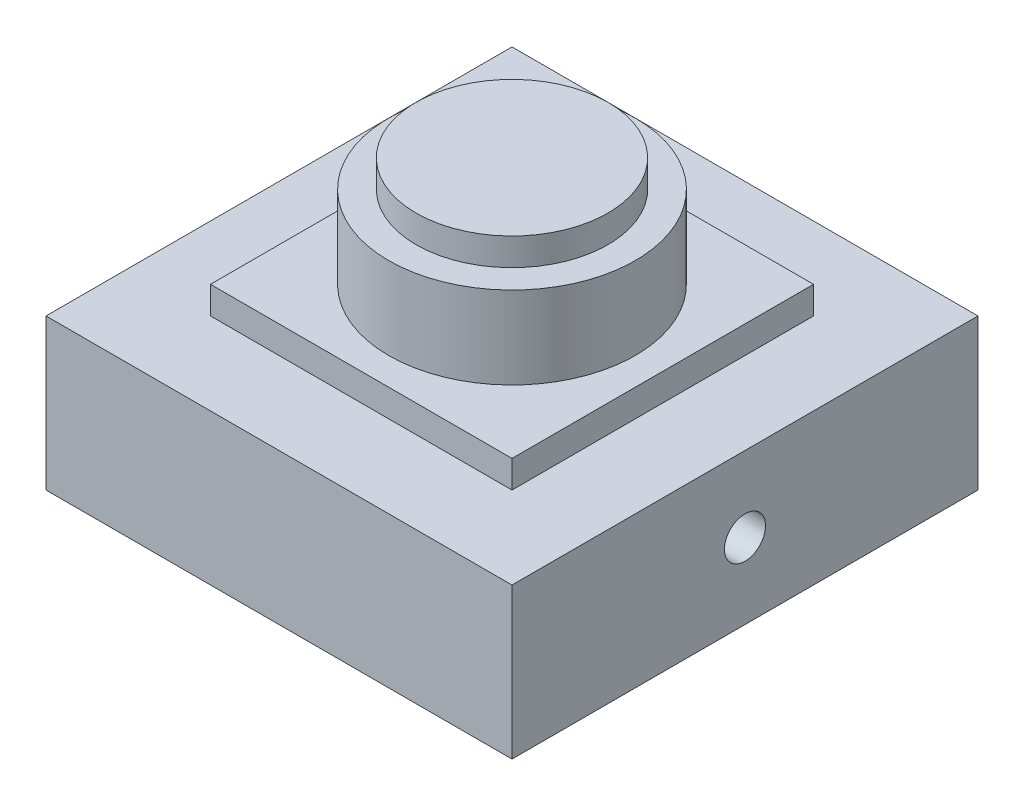
ISO-10303-21;
HEADER;
FILE_DESCRIPTION(('STEP AP214'),'2;1');
FILE_NAME('part.step','',(''),(''),'','','');
FILE_SCHEMA(('AUTOMOTIVE_DESIGN { 1 0 10303 214 1 1 1 1 }'));
ENDSEC;
DATA;
#1=APPLICATION_CONTEXT('core data for automotive mechanical design processes');
#2=APPLICATION_PROTOCOL_DEFINITION('international standard','automotive_design',2000,#1);
#3=PRODUCT_CONTEXT('',#1,'mechanical');
#4=PRODUCT('Part','Part','',(#3));
#5=PRODUCT_RELATED_PRODUCT_CATEGORY('part','',(#4));
#6=PRODUCT_DEFINITION_FORMATION('','',#4);
#7=PRODUCT_DEFINITION_CONTEXT('part definition',#1,'design');
#8=PRODUCT_DEFINITION('design','',#6,#7);
#9=PRODUCT_DEFINITION_SHAPE('','',#8);
#10=(LENGTH_UNIT() NAMED_UNIT(*) SI_UNIT(.MILLI.,.METRE.));
#11=(NAMED_UNIT(*) PLANE_ANGLE_UNIT() SI_UNIT($,.RADIAN.));
#12=(NAMED_UNIT(*) SI_UNIT($,.STERADIAN.) SOLID_ANGLE_UNIT());
#13=UNCERTAINTY_MEASURE_WITH_UNIT(LENGTH_MEASURE(1.E-05),#10,'distance_accuracy_value','');
#14=(GEOMETRIC_REPRESENTATION_CONTEXT(3) GLOBAL_UNCERTAINTY_ASSIGNED_CONTEXT((#13)) GLOBAL_UNIT_ASSIGNED_CONTEXT((#10,
#11,#12)) REPRESENTATION_CONTEXT('',''));
#15=CARTESIAN_POINT('',(0.,0.,0.));
#16=DIRECTION('',(0.,0.,1.));
#17=DIRECTION('',(1.,0.,0.));
#18=AXIS2_PLACEMENT_3D('',#15,#16,#17);
#19=CARTESIAN_POINT('',(0.,11.,0.));
#20=DIRECTION('',(0.,-1.,0.));
#21=DIRECTION('',(0.,0.,-1.));
#22=AXIS2_PLACEMENT_3D('',#19,#20,#21);
#23=PLANE('',#22);
#24=DIRECTION('',(0.,0.,-1.));
#25=VECTOR('',#24,1.);
#26=CARTESIAN_POINT('',(17.,11.,17.));
#27=LINE('',#26,#25);
#28=CARTESIAN_POINT('',(17.,11.,17.));
#29=VERTEX_POINT('',#28);
#30=CARTESIAN_POINT('',(17.,11.,-17.));
#31=VERTEX_POINT('',#30);
#32=EDGE_CURVE('E144',#29,#31,#27,.T.);
#33=ORIENTED_EDGE('',*,*,#32,.T.);
#34=DIRECTION('',(-1.,0.,0.));
#35=VECTOR('',#34,1.);
#36=CARTESIAN_POINT('',(-17.,11.,-17.));
#37=LINE('',#36,#35);
#38=CARTESIAN_POINT('',(-17.,11.,-17.));
#39=VERTEX_POINT('',#38);
#40=EDGE_CURVE('E148',#31,#39,#37,.T.);
#41=ORIENTED_EDGE('',*,*,#40,.T.);
#42=DIRECTION('',(0.,0.,1.));
#43=VECTOR('',#42,1.);
#44=CARTESIAN_POINT('',(-17.,11.,17.));
#45=LINE('',#44,#43);
#46=CARTESIAN_POINT('',(-17.,11.,17.));
#47=VERTEX_POINT('',#46);
#48=EDGE_CURVE('E152',#39,#47,#45,.T.);
#49=ORIENTED_EDGE('',*,*,#48,.T.);
#50=DIRECTION('',(1.,0.,0.));
#51=VECTOR('',#50,1.);
#52=CARTESIAN_POINT('',(-17.,11.,17.));
#53=LINE('',#52,#51);
#54=EDGE_CURVE('E155',#47,#29,#53,.T.);
#55=ORIENTED_EDGE('',*,*,#54,.T.);
#56=EDGE_LOOP('',(#33,#41,#49,#55));
#57=FACE_BOUND('',#56,.T.);
#58=DIRECTION('',(0.,0.,-1.));
#59=VECTOR('',#58,1.);
#60=CARTESIAN_POINT('',(11.,11.,11.));
#61=LINE('',#60,#59);
#62=CARTESIAN_POINT('',(11.,11.,11.));
#63=VERTEX_POINT('',#62);
#64=CARTESIAN_POINT('',(11.,11.,-11.));
#65=VERTEX_POINT('',#64);
#66=EDGE_CURVE('E60',#63,#65,#61,.T.);
#67=ORIENTED_EDGE('',*,*,#66,.F.);
#68=DIRECTION('',(1.,0.,0.));
#69=VECTOR('',#68,1.);
#70=CARTESIAN_POINT('',(-11.,11.,11.));
#71=LINE('',#70,#69);
#72=CARTESIAN_POINT('',(-11.,11.,11.));
#73=VERTEX_POINT('',#72);
#74=EDGE_CURVE('E64',#73,#63,#71,.T.);
#75=ORIENTED_EDGE('',*,*,#74,.F.);
#76=DIRECTION('',(0.,0.,1.));
#77=VECTOR('',#76,1.);
#78=CARTESIAN_POINT('',(-11.,11.,11.));
#79=LINE('',#78,#77);
#80=CARTESIAN_POINT('',(-11.,11.,-11.));
#81=VERTEX_POINT('',#80);
#82=EDGE_CURVE('E201',#81,#73,#79,.T.);
#83=ORIENTED_EDGE('',*,*,#82,.F.);
#84=DIRECTION('',(-1.,0.,0.));
#85=VECTOR('',#84,1.);
#86=CARTESIAN_POINT('',(-11.,11.,-11.));
#87=LINE('',#86,#85);
#88=EDGE_CURVE('E198',#65,#81,#87,.T.);
#89=ORIENTED_EDGE('',*,*,#88,.F.);
#90=EDGE_LOOP('',(#67,#75,#83,#89));
#91=FACE_BOUND('',#90,.T.);
#92=ADVANCED_FACE('F42',(#57,#91),#23,.F.);
#93=CARTESIAN_POINT('',(17.,11.,17.));
#94=DIRECTION('',(-1.,0.,0.));
#95=DIRECTION('',(0.,0.,1.));
#96=AXIS2_PLACEMENT_3D('',#93,#94,#95);
#97=PLANE('',#96);
#98=CARTESIAN_POINT('',(17.,5.5,0.));
#99=DIRECTION('',(1.,0.,0.));
#100=DIRECTION('',(0.,0.,-1.));
#101=AXIS2_PLACEMENT_3D('',#98,#99,#100);
#102=CIRCLE('',#101,1.5);
#103=CARTESIAN_POINT('',(17.,5.5,-1.5));
#104=VERTEX_POINT('',#103);
#105=EDGE_CURVE('E404',#104,#104,#102,.T.);
#106=ORIENTED_EDGE('',*,*,#105,.F.);
#107=EDGE_LOOP('',(#106));
#108=FACE_BOUND('',#107,.T.);
#109=DIRECTION('',(0.,0.,-1.));
#110=VECTOR('',#109,1.);
#111=CARTESIAN_POINT('',(17.,0.,17.));
#112=LINE('',#111,#110);
#113=CARTESIAN_POINT('',(17.,0.,17.));
#114=VERTEX_POINT('',#113);
#115=CARTESIAN_POINT('',(17.,0.,-17.));
#116=VERTEX_POINT('',#115);
#117=EDGE_CURVE('E133',#114,#116,#112,.T.);
#118=ORIENTED_EDGE('',*,*,#117,.T.);
#119=DIRECTION('',(0.,-1.,0.));
#120=VECTOR('',#119,1.);
#121=CARTESIAN_POINT('',(17.,11.,-17.));
#122=LINE('',#121,#120);
#123=EDGE_CURVE('E46',#31,#116,#122,.T.);
#124=ORIENTED_EDGE('',*,*,#123,.F.);
#125=ORIENTED_EDGE('',*,*,#32,.F.);
#126=DIRECTION('',(0.,-1.,0.));
#127=VECTOR('',#126,1.);
#128=CARTESIAN_POINT('',(17.,11.,17.));
#129=LINE('',#128,#127);
#130=EDGE_CURVE('E157',#29,#114,#129,.T.);
#131=ORIENTED_EDGE('',*,*,#130,.T.);
#132=EDGE_LOOP('',(#118,#124,#125,#131));
#133=FACE_BOUND('',#132,.T.);
#134=ADVANCED_FACE('F44',(#108,#133),#97,.F.);
#135=CARTESIAN_POINT('',(-17.,11.,-17.));
#136=DIRECTION('',(0.,0.,1.));
#137=DIRECTION('',(1.,0.,0.));
#138=AXIS2_PLACEMENT_3D('',#135,#136,#137);
#139=PLANE('',#138);
#140=DIRECTION('',(-1.,0.,0.));
#141=VECTOR('',#140,1.);
#142=CARTESIAN_POINT('',(-17.,0.,-17.));
#143=LINE('',#142,#141);
#144=CARTESIAN_POINT('',(-17.,0.,-17.));
#145=VERTEX_POINT('',#144);
#146=EDGE_CURVE('E138',#116,#145,#143,.T.);
#147=ORIENTED_EDGE('',*,*,#146,.T.);
#148=DIRECTION('',(0.,-1.,0.));
#149=VECTOR('',#148,1.);
#150=CARTESIAN_POINT('',(-17.,11.,-17.));
#151=LINE('',#150,#149);
#152=EDGE_CURVE('E172',#39,#145,#151,.T.);
#153=ORIENTED_EDGE('',*,*,#152,.F.);
#154=ORIENTED_EDGE('',*,*,#40,.F.);
#155=ORIENTED_EDGE('',*,*,#123,.T.);
#156=EDGE_LOOP('',(#147,#153,#154,#155));
#157=FACE_BOUND('',#156,.T.);
#158=ADVANCED_FACE('F221',(#157),#139,.F.);
#159=CARTESIAN_POINT('',(-17.,11.,17.));
#160=DIRECTION('',(1.,0.,0.));
#161=DIRECTION('',(0.,0.,-1.));
#162=AXIS2_PLACEMENT_3D('',#159,#160,#161);
#163=PLANE('',#162);
#164=CARTESIAN_POINT('',(-17.,5.5,0.));
#165=DIRECTION('',(1.,0.,0.));
#166=DIRECTION('',(0.,0.,-1.));
#167=AXIS2_PLACEMENT_3D('',#164,#165,#166);
#168=CIRCLE('',#167,1.5);
#169=CARTESIAN_POINT('',(-17.,5.5,-1.5));
#170=VERTEX_POINT('',#169);
#171=EDGE_CURVE('E401',#170,#170,#168,.F.);
#172=ORIENTED_EDGE('',*,*,#171,.F.);
#173=EDGE_LOOP('',(#172));
#174=FACE_BOUND('',#173,.T.);
#175=DIRECTION('',(0.,0.,1.));
#176=VECTOR('',#175,1.);
#177=CARTESIAN_POINT('',(-17.,0.,17.));
#178=LINE('',#177,#176);
#179=CARTESIAN_POINT('',(-17.,0.,17.));
#180=VERTEX_POINT('',#179);
#181=EDGE_CURVE('E161',#145,#180,#178,.T.);
#182=ORIENTED_EDGE('',*,*,#181,.T.);
#183=DIRECTION('',(0.,-1.,0.));
#184=VECTOR('',#183,1.);
#185=CARTESIAN_POINT('',(-17.,11.,17.));
#186=LINE('',#185,#184);
#187=EDGE_CURVE('E169',#47,#180,#186,.T.);
#188=ORIENTED_EDGE('',*,*,#187,.F.);
#189=ORIENTED_EDGE('',*,*,#48,.F.);
#190=ORIENTED_EDGE('',*,*,#152,.T.);
#191=EDGE_LOOP('',(#182,#188,#189,#190));
#192=FACE_BOUND('',#191,.T.);
#193=ADVANCED_FACE('F233',(#174,#192),#163,.F.);
#194=CARTESIAN_POINT('',(-17.,11.,17.));
#195=DIRECTION('',(0.,0.,-1.));
#196=DIRECTION('',(-1.,0.,0.));
#197=AXIS2_PLACEMENT_3D('',#194,#195,#196);
#198=PLANE('',#197);
#199=DIRECTION('',(1.,0.,0.));
#200=VECTOR('',#199,1.);
#201=CARTESIAN_POINT('',(-17.,0.,17.));
#202=LINE('',#201,#200);
#203=EDGE_CURVE('E149',#180,#114,#202,.T.);
#204=ORIENTED_EDGE('',*,*,#203,.T.);
#205=ORIENTED_EDGE('',*,*,#130,.F.);
#206=ORIENTED_EDGE('',*,*,#54,.F.);
#207=ORIENTED_EDGE('',*,*,#187,.T.);
#208=EDGE_LOOP('',(#204,#205,#206,#207));
#209=FACE_BOUND('',#208,.T.);
#210=ADVANCED_FACE('F229',(#209),#198,.F.);
#211=CARTESIAN_POINT('',(0.,0.,0.));
#212=DIRECTION('',(0.,-1.,0.));
#213=DIRECTION('',(0.,0.,-1.));
#214=AXIS2_PLACEMENT_3D('',#211,#212,#213);
#215=PLANE('',#214);
#216=ORIENTED_EDGE('',*,*,#117,.F.);
#217=ORIENTED_EDGE('',*,*,#203,.F.);
#218=ORIENTED_EDGE('',*,*,#181,.F.);
#219=ORIENTED_EDGE('',*,*,#146,.F.);
#220=EDGE_LOOP('',(#216,#217,#218,#219));
#221=FACE_BOUND('',#220,.T.);
#222=ADVANCED_FACE('F226',(#221),#215,.T.);
#223=CARTESIAN_POINT('',(11.,13.,11.));
#224=DIRECTION('',(-1.,0.,0.));
#225=DIRECTION('',(0.,0.,1.));
#226=AXIS2_PLACEMENT_3D('',#223,#224,#225);
#227=PLANE('',#226);
#228=ORIENTED_EDGE('',*,*,#66,.T.);
#229=DIRECTION('',(0.,-1.,0.));
#230=VECTOR('',#229,1.);
#231=CARTESIAN_POINT('',(11.,13.,-11.));
#232=LINE('',#231,#230);
#233=CARTESIAN_POINT('',(11.,13.,-11.));
#234=VERTEX_POINT('',#233);
#235=EDGE_CURVE('E113',#234,#65,#232,.T.);
#236=ORIENTED_EDGE('',*,*,#235,.F.);
#237=DIRECTION('',(0.,0.,-1.));
#238=VECTOR('',#237,1.);
#239=CARTESIAN_POINT('',(11.,13.,11.));
#240=LINE('',#239,#238);
#241=CARTESIAN_POINT('',(11.,13.,11.));
#242=VERTEX_POINT('',#241);
#243=EDGE_CURVE('E120',#242,#234,#240,.T.);
#244=ORIENTED_EDGE('',*,*,#243,.F.);
#245=DIRECTION('',(0.,-1.,0.));
#246=VECTOR('',#245,1.);
#247=CARTESIAN_POINT('',(11.,13.,11.));
#248=LINE('',#247,#246);
#249=EDGE_CURVE('E195',#242,#63,#248,.T.);
#250=ORIENTED_EDGE('',*,*,#249,.T.);
#251=EDGE_LOOP('',(#228,#236,#244,#250));
#252=FACE_BOUND('',#251,.T.);
#253=ADVANCED_FACE('F131',(#252),#227,.F.);
#254=CARTESIAN_POINT('',(-11.,13.,-11.));
#255=DIRECTION('',(0.,0.,1.));
#256=DIRECTION('',(1.,0.,0.));
#257=AXIS2_PLACEMENT_3D('',#254,#255,#256);
#258=PLANE('',#257);
#259=ORIENTED_EDGE('',*,*,#88,.T.);
#260=DIRECTION('',(0.,-1.,0.));
#261=VECTOR('',#260,1.);
#262=CARTESIAN_POINT('',(-11.,13.,-11.));
#263=LINE('',#262,#261);
#264=CARTESIAN_POINT('',(-11.,13.,-11.));
#265=VERTEX_POINT('',#264);
#266=EDGE_CURVE('E115',#265,#81,#263,.T.);
#267=ORIENTED_EDGE('',*,*,#266,.F.);
#268=DIRECTION('',(-1.,0.,0.));
#269=VECTOR('',#268,1.);
#270=CARTESIAN_POINT('',(-11.,13.,-11.));
#271=LINE('',#270,#269);
#272=EDGE_CURVE('E108',#234,#265,#271,.T.);
#273=ORIENTED_EDGE('',*,*,#272,.F.);
#274=ORIENTED_EDGE('',*,*,#235,.T.);
#275=EDGE_LOOP('',(#259,#267,#273,#274));
#276=FACE_BOUND('',#275,.T.);
#277=ADVANCED_FACE('F111',(#276),#258,.F.);
#278=CARTESIAN_POINT('',(-11.,13.,11.));
#279=DIRECTION('',(1.,0.,0.));
#280=DIRECTION('',(0.,0.,-1.));
#281=AXIS2_PLACEMENT_3D('',#278,#279,#280);
#282=PLANE('',#281);
#283=ORIENTED_EDGE('',*,*,#82,.T.);
#284=DIRECTION('',(0.,-1.,0.));
#285=VECTOR('',#284,1.);
#286=CARTESIAN_POINT('',(-11.,13.,11.));
#287=LINE('',#286,#285);
#288=CARTESIAN_POINT('',(-11.,13.,11.));
#289=VERTEX_POINT('',#288);
#290=EDGE_CURVE('E140',#289,#73,#287,.T.);
#291=ORIENTED_EDGE('',*,*,#290,.F.);
#292=DIRECTION('',(0.,0.,1.));
#293=VECTOR('',#292,1.);
#294=CARTESIAN_POINT('',(-11.,13.,11.));
#295=LINE('',#294,#293);
#296=EDGE_CURVE('E119',#265,#289,#295,.T.);
#297=ORIENTED_EDGE('',*,*,#296,.F.);
#298=ORIENTED_EDGE('',*,*,#266,.T.);
#299=EDGE_LOOP('',(#283,#291,#297,#298));
#300=FACE_BOUND('',#299,.T.);
#301=ADVANCED_FACE('F213',(#300),#282,.F.);
#302=CARTESIAN_POINT('',(-11.,13.,11.));
#303=DIRECTION('',(0.,0.,-1.));
#304=DIRECTION('',(-1.,0.,0.));
#305=AXIS2_PLACEMENT_3D('',#302,#303,#304);
#306=PLANE('',#305);
#307=ORIENTED_EDGE('',*,*,#74,.T.);
#308=ORIENTED_EDGE('',*,*,#249,.F.);
#309=DIRECTION('',(1.,0.,0.));
#310=VECTOR('',#309,1.);
#311=CARTESIAN_POINT('',(-11.,13.,11.));
#312=LINE('',#311,#310);
#313=EDGE_CURVE('E125',#289,#242,#312,.T.);
#314=ORIENTED_EDGE('',*,*,#313,.F.);
#315=ORIENTED_EDGE('',*,*,#290,.T.);
#316=EDGE_LOOP('',(#307,#308,#314,#315));
#317=FACE_BOUND('',#316,.T.);
#318=ADVANCED_FACE('F211',(#317),#306,.F.);
#319=CARTESIAN_POINT('',(0.,13.,0.));
#320=DIRECTION('',(0.,-1.,0.));
#321=DIRECTION('',(0.,0.,-1.));
#322=AXIS2_PLACEMENT_3D('',#319,#320,#321);
#323=PLANE('',#322);
#324=CARTESIAN_POINT('',(0.,13.,0.));
#325=DIRECTION('',(0.,1.,0.));
#326=DIRECTION('',(0.,0.,1.));
#327=AXIS2_PLACEMENT_3D('',#324,#325,#326);
#328=CIRCLE('',#327,9.);
#329=CARTESIAN_POINT('',(0.,13.,9.));
#330=VERTEX_POINT('',#329);
#331=EDGE_CURVE('E52',#330,#330,#328,.T.);
#332=ORIENTED_EDGE('',*,*,#331,.F.);
#333=EDGE_LOOP('',(#332));
#334=FACE_BOUND('',#333,.T.);
#335=ORIENTED_EDGE('',*,*,#243,.T.);
#336=ORIENTED_EDGE('',*,*,#272,.T.);
#337=ORIENTED_EDGE('',*,*,#296,.T.);
#338=ORIENTED_EDGE('',*,*,#313,.T.);
#339=EDGE_LOOP('',(#335,#336,#337,#338));
#340=FACE_BOUND('',#339,.T.);
#341=ADVANCED_FACE('F123',(#334,#340),#323,.F.);
#342=CARTESIAN_POINT('',(0.,19.,0.));
#343=DIRECTION('',(0.,-1.,0.));
#344=DIRECTION('',(0.,0.,-1.));
#345=AXIS2_PLACEMENT_3D('',#342,#343,#344);
#346=CYLINDRICAL_SURFACE('',#345,9.);
#347=CARTESIAN_POINT('',(0.,19.,0.));
#348=DIRECTION('',(0.,1.,0.));
#349=DIRECTION('',(0.,0.,1.));
#350=AXIS2_PLACEMENT_3D('',#347,#348,#349);
#351=CIRCLE('',#350,9.);
#352=CARTESIAN_POINT('',(0.,19.,9.));
#353=VERTEX_POINT('',#352);
#354=EDGE_CURVE('E189',#353,#353,#351,.T.);
#355=ORIENTED_EDGE('',*,*,#354,.F.);
#356=EDGE_LOOP('',(#355));
#357=FACE_BOUND('',#356,.T.);
#358=ORIENTED_EDGE('',*,*,#331,.T.);
#359=EDGE_LOOP('',(#358));
#360=FACE_BOUND('',#359,.T.);
#361=ADVANCED_FACE('F293',(#357,#360),#346,.T.);
#362=CARTESIAN_POINT('',(0.,19.,0.));
#363=DIRECTION('',(0.,1.,0.));
#364=DIRECTION('',(0.,0.,1.));
#365=AXIS2_PLACEMENT_3D('',#362,#363,#364);
#366=PLANE('',#365);
#367=CARTESIAN_POINT('',(0.,19.,0.));
#368=DIRECTION('',(0.,1.,0.));
#369=DIRECTION('',(0.,0.,1.));
#370=AXIS2_PLACEMENT_3D('',#367,#368,#369);
#371=CIRCLE('',#370,7.);
#372=CARTESIAN_POINT('',(0.,19.,7.));
#373=VERTEX_POINT('',#372);
#374=EDGE_CURVE('E11',#373,#373,#371,.T.);
#375=ORIENTED_EDGE('',*,*,#374,.F.);
#376=EDGE_LOOP('',(#375));
#377=FACE_BOUND('',#376,.T.);
#378=ORIENTED_EDGE('',*,*,#354,.T.);
#379=EDGE_LOOP('',(#378));
#380=FACE_BOUND('',#379,.T.);
#381=ADVANCED_FACE('F301',(#377,#380),#366,.T.);
#382=CARTESIAN_POINT('',(0.,21.,0.));
#383=DIRECTION('',(0.,-1.,0.));
#384=DIRECTION('',(0.,0.,-1.));
#385=AXIS2_PLACEMENT_3D('',#382,#383,#384);
#386=CYLINDRICAL_SURFACE('',#385,7.);
#387=CARTESIAN_POINT('',(0.,21.,0.));
#388=DIRECTION('',(0.,1.,0.));
#389=DIRECTION('',(0.,0.,1.));
#390=AXIS2_PLACEMENT_3D('',#387,#388,#389);
#391=CIRCLE('',#390,7.);
#392=CARTESIAN_POINT('',(0.,21.,7.));
#393=VERTEX_POINT('',#392);
#394=EDGE_CURVE('E408',#393,#393,#391,.T.);
#395=ORIENTED_EDGE('',*,*,#394,.F.);
#396=EDGE_LOOP('',(#395));
#397=FACE_BOUND('',#396,.T.);
#398=ORIENTED_EDGE('',*,*,#374,.T.);
#399=EDGE_LOOP('',(#398));
#400=FACE_BOUND('',#399,.T.);
#401=ADVANCED_FACE('F309',(#397,#400),#386,.T.);
#402=CARTESIAN_POINT('',(0.,21.,0.));
#403=DIRECTION('',(0.,1.,0.));
#404=DIRECTION('',(0.,0.,1.));
#405=AXIS2_PLACEMENT_3D('',#402,#403,#404);
#406=PLANE('',#405);
#407=ORIENTED_EDGE('',*,*,#394,.T.);
#408=EDGE_LOOP('',(#407));
#409=FACE_BOUND('',#408,.T.);
#410=ADVANCED_FACE('F317',(#409),#406,.T.);
#411=CARTESIAN_POINT('',(-21.2426406871193,5.5,0.));
#412=DIRECTION('',(1.,0.,0.));
#413=DIRECTION('',(0.,0.,-1.));
#414=AXIS2_PLACEMENT_3D('',#411,#412,#413);
#415=CYLINDRICAL_SURFACE('',#414,1.5);
#416=CARTESIAN_POINT('',(-17.,5.5,-1.5));
#417=CARTESIAN_POINT('',(-16.6458333333333,5.5,-1.5));
#418=CARTESIAN_POINT('',(-16.2916666666667,5.5,-1.5));
#419=CARTESIAN_POINT('',(-15.5833333333333,5.5,-1.5));
#420=CARTESIAN_POINT('',(-15.2291666666667,5.5,-1.5));
#421=CARTESIAN_POINT('',(-14.5208333333333,5.5,-1.5));
#422=CARTESIAN_POINT('',(-14.1666666666667,5.5,-1.5));
#423=CARTESIAN_POINT('',(-13.4583333333333,5.5,-1.5));
#424=CARTESIAN_POINT('',(-13.1041666666667,5.5,-1.5));
#425=CARTESIAN_POINT('',(-12.3958333333333,5.5,-1.5));
#426=CARTESIAN_POINT('',(-12.0416666666667,5.5,-1.5));
#427=CARTESIAN_POINT('',(-11.3333333333333,5.5,-1.5));
#428=CARTESIAN_POINT('',(-10.9791666666667,5.5,-1.5));
#429=CARTESIAN_POINT('',(-10.2708333333333,5.5,-1.5));
#430=CARTESIAN_POINT('',(-9.91666666666667,5.5,-1.5));
#431=CARTESIAN_POINT('',(-9.20833333333334,5.5,-1.5));
#432=CARTESIAN_POINT('',(-8.85416666666667,5.5,-1.5));
#433=CARTESIAN_POINT('',(-8.14583333333334,5.5,-1.5));
#434=CARTESIAN_POINT('',(-7.79166666666667,5.5,-1.5));
#435=CARTESIAN_POINT('',(-7.08333333333334,5.5,-1.5));
#436=CARTESIAN_POINT('',(-6.72916666666667,5.5,-1.5));
#437=CARTESIAN_POINT('',(-6.02083333333334,5.5,-1.5));
#438=CARTESIAN_POINT('',(-5.66666666666667,5.5,-1.5));
#439=CARTESIAN_POINT('',(-4.95833333333334,5.5,-1.5));
#440=CARTESIAN_POINT('',(-4.60416666666667,5.5,-1.5));
#441=CARTESIAN_POINT('',(-3.89583333333334,5.5,-1.5));
#442=CARTESIAN_POINT('',(-3.54166666666667,5.5,-1.5));
#443=CARTESIAN_POINT('',(-2.83333333333334,5.5,-1.5));
#444=CARTESIAN_POINT('',(-2.47916666666667,5.5,-1.5));
#445=CARTESIAN_POINT('',(-1.77083333333334,5.5,-1.5));
#446=CARTESIAN_POINT('',(-1.41666666666667,5.5,-1.5));
#447=CARTESIAN_POINT('',(-0.708333333333341,5.5,-1.5));
#448=CARTESIAN_POINT('',(-0.354166666666674,5.5,-1.5));
#449=CARTESIAN_POINT('',(0.35416666666666,5.5,-1.5));
#450=CARTESIAN_POINT('',(0.708333333333327,5.5,-1.5));
#451=CARTESIAN_POINT('',(1.41666666666666,5.5,-1.5));
#452=CARTESIAN_POINT('',(1.77083333333333,5.5,-1.5));
#453=CARTESIAN_POINT('',(2.47916666666666,5.5,-1.5));
#454=CARTESIAN_POINT('',(2.83333333333333,5.5,-1.5));
#455=CARTESIAN_POINT('',(3.54166666666666,5.5,-1.5));
#456=CARTESIAN_POINT('',(3.89583333333333,5.5,-1.5));
#457=CARTESIAN_POINT('',(4.60416666666666,5.5,-1.5));
#458=CARTESIAN_POINT('',(4.95833333333333,5.5,-1.5));
#459=CARTESIAN_POINT('',(5.66666666666666,5.5,-1.5));
#460=CARTESIAN_POINT('',(6.02083333333333,5.5,-1.5));
#461=CARTESIAN_POINT('',(6.72916666666666,5.5,-1.5));
#462=CARTESIAN_POINT('',(7.08333333333333,5.5,-1.5));
#463=CARTESIAN_POINT('',(7.79166666666666,5.5,-1.5));
#464=CARTESIAN_POINT('',(8.14583333333333,5.5,-1.5));
#465=CARTESIAN_POINT('',(8.85416666666666,5.5,-1.5));
#466=CARTESIAN_POINT('',(9.20833333333333,5.5,-1.5));
#467=CARTESIAN_POINT('',(9.91666666666666,5.5,-1.5));
#468=CARTESIAN_POINT('',(10.2708333333333,5.5,-1.5));
#469=CARTESIAN_POINT('',(10.9791666666667,5.5,-1.5));
#470=CARTESIAN_POINT('',(11.3333333333333,5.5,-1.5));
#471=CARTESIAN_POINT('',(12.0416666666667,5.5,-1.5));
#472=CARTESIAN_POINT('',(12.3958333333333,5.5,-1.5));
#473=CARTESIAN_POINT('',(13.1041666666667,5.5,-1.5));
#474=CARTESIAN_POINT('',(13.4583333333333,5.5,-1.5));
#475=CARTESIAN_POINT('',(14.1666666666667,5.5,-1.5));
#476=CARTESIAN_POINT('',(14.5208333333333,5.5,-1.5));
#477=CARTESIAN_POINT('',(15.2291666666667,5.5,-1.5));
#478=CARTESIAN_POINT('',(15.5833333333333,5.5,-1.5));
#479=CARTESIAN_POINT('',(16.2916666666667,5.5,-1.5));
#480=CARTESIAN_POINT('',(16.6458333333333,5.5,-1.5));
#481=CARTESIAN_POINT('',(17.,5.5,-1.5));
#482=B_SPLINE_CURVE_WITH_KNOTS('',3,(#416,#417,#418,#419,#420,#421,#422,#423,#424,#425,#426,
#427,#428,#429,#430,#431,#432,#433,#434,#435,#436,#437,#438,#439,#440,#441,#442,#443,#444,#445,
#446,#447,#448,#449,#450,#451,#452,#453,#454,#455,#456,#457,#458,#459,#460,#461,#462,#463,#464,
#465,#466,#467,#468,#469,#470,#471,#472,#473,#474,#475,#476,#477,#478,#479,#480,#481),
.UNSPECIFIED.,.F.,.F.,(4,2,2,2,2,2,2,2,2,2,2,2,2,2,2,2,2,2,2,2,2,2,2,2,2,2,2,2,2,2,2,2,4),(0.,
1.0625,2.125,3.1875,4.25,5.3125,6.375,7.4375,8.5,9.5625,10.625,11.6875,12.75,13.8125,14.875,
15.9375,17.,18.0625,19.125,20.1875,21.25,22.3125,23.375,24.4375,25.5,26.5625,27.625,28.6875,
29.75,30.8125,31.875,32.9375,34.),.UNSPECIFIED.);
#483=EDGE_CURVE('BSEAM325',#170,#104,#482,.T.);
#484=ORIENTED_EDGE('',*,*,#171,.T.);
#485=ORIENTED_EDGE('',*,*,#105,.T.);
#486=ORIENTED_EDGE('',*,*,#483,.T.);
#487=ORIENTED_EDGE('',*,*,#483,.F.);
#488=EDGE_LOOP('',(#484,#486,#485,#487));
#489=FACE_BOUND('',#488,.T.);
#490=ADVANCED_FACE('F325',(#489),#415,.F.);
#491=CLOSED_SHELL('',(#92,#134,#158,#193,#210,#222,#253,#277,#301,#318,#341,#361,#381,#401,#410,#490));
#492=MANIFOLD_SOLID_BREP('B2',#491);
#493=ADVANCED_BREP_SHAPE_REPRESENTATION('',(#18,#492),#14);
#494=SHAPE_DEFINITION_REPRESENTATION(#9,#493);
ENDSEC;
END-ISO-10303-21;
